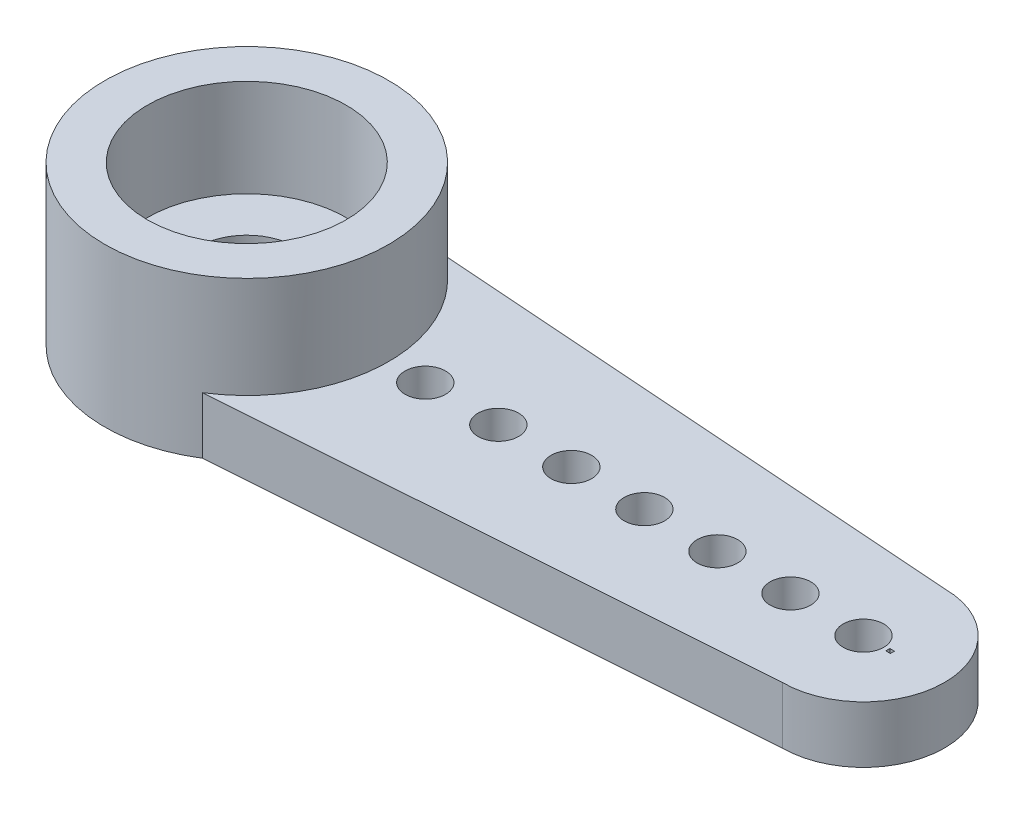
ISO-10303-21;
HEADER;
FILE_DESCRIPTION(('STEP AP214'),'2;1');
FILE_NAME('part.step','',(''),(''),'','','');
FILE_SCHEMA(('AUTOMOTIVE_DESIGN { 1 0 10303 214 1 1 1 1 }'));
ENDSEC;
DATA;
#1=APPLICATION_CONTEXT('core data for automotive mechanical design processes');
#2=APPLICATION_PROTOCOL_DEFINITION('international standard','automotive_design',2000,#1);
#3=PRODUCT_CONTEXT('',#1,'mechanical');
#4=PRODUCT('Part','Part','',(#3));
#5=PRODUCT_RELATED_PRODUCT_CATEGORY('part','',(#4));
#6=PRODUCT_DEFINITION_FORMATION('','',#4);
#7=PRODUCT_DEFINITION_CONTEXT('part definition',#1,'design');
#8=PRODUCT_DEFINITION('design','',#6,#7);
#9=PRODUCT_DEFINITION_SHAPE('','',#8);
#10=(LENGTH_UNIT() NAMED_UNIT(*) SI_UNIT(.MILLI.,.METRE.));
#11=(NAMED_UNIT(*) PLANE_ANGLE_UNIT() SI_UNIT($,.RADIAN.));
#12=(NAMED_UNIT(*) SI_UNIT($,.STERADIAN.) SOLID_ANGLE_UNIT());
#13=UNCERTAINTY_MEASURE_WITH_UNIT(LENGTH_MEASURE(1.E-05),#10,'distance_accuracy_value','');
#14=(GEOMETRIC_REPRESENTATION_CONTEXT(3) GLOBAL_UNCERTAINTY_ASSIGNED_CONTEXT((#13)) GLOBAL_UNIT_ASSIGNED_CONTEXT((#10,
#11,#12)) REPRESENTATION_CONTEXT('',''));
#15=CARTESIAN_POINT('',(0.,0.,0.));
#16=DIRECTION('',(0.,0.,1.));
#17=DIRECTION('',(1.,0.,0.));
#18=AXIS2_PLACEMENT_3D('',#15,#16,#17);
#19=CARTESIAN_POINT('',(-15.2,1.4,0.));
#20=DIRECTION('',(0.,1.,0.));
#21=DIRECTION('',(0.,0.,1.));
#22=AXIS2_PLACEMENT_3D('',#19,#20,#21);
#23=PLANE('',#22);
#24=DIRECTION('',(0.999999999999999,0.,0.));
#25=VECTOR('',#24,1.);
#26=CARTESIAN_POINT('',(1.38777878078145E-13,1.40000000000001,0.0499999999999945));
#27=LINE('',#26,#25);
#28=CARTESIAN_POINT('',(15.8000000000002,1.40000000000001,0.0499999999999945));
#29=VERTEX_POINT('',#28);
#30=CARTESIAN_POINT('',(15.9141028522073,1.4,0.0499999999999945));
#31=VERTEX_POINT('',#30);
#32=EDGE_CURVE('E50',#29,#31,#27,.T.);
#33=ORIENTED_EDGE('',*,*,#32,.F.);
#34=DIRECTION('',(0.,0.,-0.999999999999999));
#35=VECTOR('',#34,1.);
#36=CARTESIAN_POINT('',(15.8000000000001,1.40000000000001,0.));
#37=LINE('',#36,#35);
#38=CARTESIAN_POINT('',(15.8,1.40000000000001,-0.0500000000000222));
#39=VERTEX_POINT('',#38);
#40=EDGE_CURVE('E119',#29,#39,#37,.T.);
#41=ORIENTED_EDGE('',*,*,#40,.T.);
#42=DIRECTION('',(0.999999999999999,0.,0.));
#43=VECTOR('',#42,1.);
#44=CARTESIAN_POINT('',(1.66533453693773E-13,1.40000000000001,-0.0499999999999945));
#45=LINE('',#44,#43);
#46=CARTESIAN_POINT('',(15.9141028522072,1.40000000000001,-0.0499999999999945));
#47=VERTEX_POINT('',#46);
#48=EDGE_CURVE('E122',#39,#47,#45,.T.);
#49=ORIENTED_EDGE('',*,*,#48,.T.);
#50=DIRECTION('',(0.,0.,-0.999999999999999));
#51=VECTOR('',#50,1.);
#52=CARTESIAN_POINT('',(15.9141028522073,1.40000000000001,0.));
#53=LINE('',#52,#51);
#54=EDGE_CURVE('E128',#31,#47,#53,.T.);
#55=ORIENTED_EDGE('',*,*,#54,.F.);
#56=EDGE_LOOP('',(#33,#41,#49,#55));
#57=FACE_BOUND('',#56,.T.);
#58=CARTESIAN_POINT('',(6.2,1.4,0.));
#59=DIRECTION('',(0.,1.,0.));
#60=DIRECTION('',(0.,0.,1.));
#61=AXIS2_PLACEMENT_3D('',#58,#59,#60);
#62=CIRCLE('',#61,0.499999999999997);
#63=CARTESIAN_POINT('',(6.2,1.4,0.500000000000053));
#64=VERTEX_POINT('',#63);
#65=EDGE_CURVE('E180',#64,#64,#62,.T.);
#66=ORIENTED_EDGE('',*,*,#65,.F.);
#67=EDGE_LOOP('',(#66));
#68=FACE_BOUND('',#67,.T.);
#69=CARTESIAN_POINT('',(9.8,1.4,0.));
#70=DIRECTION('',(0.,1.,0.));
#71=DIRECTION('',(0.,0.,1.));
#72=AXIS2_PLACEMENT_3D('',#69,#70,#71);
#73=CIRCLE('',#72,0.499999999999997);
#74=CARTESIAN_POINT('',(9.8,1.4,0.500000000000028));
#75=VERTEX_POINT('',#74);
#76=EDGE_CURVE('E192',#75,#75,#73,.T.);
#77=ORIENTED_EDGE('',*,*,#76,.F.);
#78=EDGE_LOOP('',(#77));
#79=FACE_BOUND('',#78,.T.);
#80=CARTESIAN_POINT('',(13.4,1.4,0.));
#81=DIRECTION('',(0.,1.,0.));
#82=DIRECTION('',(0.,0.,1.));
#83=AXIS2_PLACEMENT_3D('',#80,#81,#82);
#84=CIRCLE('',#83,0.499999999999997);
#85=CARTESIAN_POINT('',(13.4,1.4,0.500000000000003));
#86=VERTEX_POINT('',#85);
#87=EDGE_CURVE('E204',#86,#86,#84,.T.);
#88=ORIENTED_EDGE('',*,*,#87,.F.);
#89=EDGE_LOOP('',(#88));
#90=FACE_BOUND('',#89,.T.);
#91=CARTESIAN_POINT('',(15.2,1.4,0.));
#92=DIRECTION('',(0.,1.,0.));
#93=DIRECTION('',(0.,0.,1.));
#94=AXIS2_PLACEMENT_3D('',#91,#92,#93);
#95=CIRCLE('',#94,0.499999999999997);
#96=CARTESIAN_POINT('',(15.2,1.4,0.49999999999999));
#97=VERTEX_POINT('',#96);
#98=EDGE_CURVE('E210',#97,#97,#95,.T.);
#99=ORIENTED_EDGE('',*,*,#98,.F.);
#100=EDGE_LOOP('',(#99));
#101=FACE_BOUND('',#100,.T.);
#102=CARTESIAN_POINT('',(11.6,1.4,0.));
#103=DIRECTION('',(0.,1.,0.));
#104=DIRECTION('',(0.,0.,1.));
#105=AXIS2_PLACEMENT_3D('',#102,#103,#104);
#106=CIRCLE('',#105,0.499999999999999);
#107=CARTESIAN_POINT('',(11.6,1.4,0.500000000000017));
#108=VERTEX_POINT('',#107);
#109=EDGE_CURVE('E198',#108,#108,#106,.T.);
#110=ORIENTED_EDGE('',*,*,#109,.F.);
#111=EDGE_LOOP('',(#110));
#112=FACE_BOUND('',#111,.T.);
#113=CARTESIAN_POINT('',(8.,1.4,0.));
#114=DIRECTION('',(0.,1.,0.));
#115=DIRECTION('',(0.,0.,1.));
#116=AXIS2_PLACEMENT_3D('',#113,#114,#115);
#117=CIRCLE('',#116,0.499999999999997);
#118=CARTESIAN_POINT('',(8.,1.4,0.500000000000041));
#119=VERTEX_POINT('',#118);
#120=EDGE_CURVE('E186',#119,#119,#117,.T.);
#121=ORIENTED_EDGE('',*,*,#120,.F.);
#122=EDGE_LOOP('',(#121));
#123=FACE_BOUND('',#122,.T.);
#124=CARTESIAN_POINT('',(4.4,1.4,0.));
#125=DIRECTION('',(0.,1.,0.));
#126=DIRECTION('',(0.,0.,1.));
#127=AXIS2_PLACEMENT_3D('',#124,#125,#126);
#128=CIRCLE('',#127,0.499999999999997);
#129=CARTESIAN_POINT('',(4.4,1.4,0.500000000000066));
#130=VERTEX_POINT('',#129);
#131=EDGE_CURVE('E174',#130,#130,#128,.T.);
#132=ORIENTED_EDGE('',*,*,#131,.F.);
#133=EDGE_LOOP('',(#132));
#134=FACE_BOUND('',#133,.T.);
#135=CARTESIAN_POINT('',(0.,1.4,0.));
#136=DIRECTION('',(0.,1.,0.));
#137=DIRECTION('',(0.,0.,1.));
#138=AXIS2_PLACEMENT_3D('',#135,#136,#137);
#139=CIRCLE('',#138,3.5);
#140=CARTESIAN_POINT('',(1.86858471289894,1.4,2.95945791838985));
#141=VERTEX_POINT('',#140);
#142=CARTESIAN_POINT('',(1.86858471289894,1.4,-2.95945791838985));
#143=VERTEX_POINT('',#142);
#144=EDGE_CURVE('E161',#141,#143,#139,.T.);
#145=ORIENTED_EDGE('',*,*,#144,.F.);
#146=DIRECTION('',(0.997420198870011,0.,-0.0717840294641297));
#147=VECTOR('',#146,1.);
#148=CARTESIAN_POINT('',(-14.9001527327747,1.4,4.16629887091939));
#149=LINE('',#148,#147);
#150=CARTESIAN_POINT('',(15.2,1.4,2.));
#151=VERTEX_POINT('',#150);
#152=EDGE_CURVE('E151',#141,#151,#149,.T.);
#153=ORIENTED_EDGE('',*,*,#152,.T.);
#154=CARTESIAN_POINT('',(15.2,1.4,0.));
#155=DIRECTION('',(0.,1.,0.));
#156=DIRECTION('',(0.,0.,-1.));
#157=AXIS2_PLACEMENT_3D('',#154,#155,#156);
#158=CIRCLE('',#157,2.);
#159=CARTESIAN_POINT('',(15.2,1.4,-2.));
#160=VERTEX_POINT('',#159);
#161=EDGE_CURVE('E216',#151,#160,#158,.T.);
#162=ORIENTED_EDGE('',*,*,#161,.T.);
#163=DIRECTION('',(-0.997420198870011,0.,-0.0717840294641295));
#164=VECTOR('',#163,1.);
#165=CARTESIAN_POINT('',(-14.9001527327747,1.4,-4.16629887091939));
#166=LINE('',#165,#164);
#167=EDGE_CURVE('E146',#160,#143,#166,.T.);
#168=ORIENTED_EDGE('',*,*,#167,.T.);
#169=EDGE_LOOP('',(#145,#153,#162,#168));
#170=FACE_BOUND('',#169,.T.);
#171=ADVANCED_FACE('F35',(#57,#68,#79,#90,#101,#112,#123,#134,#170),#23,.T.);
#172=CARTESIAN_POINT('',(-15.2,0.,0.));
#173=DIRECTION('',(0.,1.,0.));
#174=DIRECTION('',(0.,0.,1.));
#175=AXIS2_PLACEMENT_3D('',#172,#173,#174);
#176=PLANE('',#175);
#177=CARTESIAN_POINT('',(0.,0.,0.));
#178=DIRECTION('',(0.,-1.,0.));
#179=DIRECTION('',(0.,0.,-1.));
#180=AXIS2_PLACEMENT_3D('',#177,#178,#179);
#181=CIRCLE('',#180,2.35);
#182=CARTESIAN_POINT('',(0.,0.,-2.35));
#183=VERTEX_POINT('',#182);
#184=EDGE_CURVE('E165',#183,#183,#181,.T.);
#185=ORIENTED_EDGE('',*,*,#184,.F.);
#186=EDGE_LOOP('',(#185));
#187=FACE_BOUND('',#186,.T.);
#188=CARTESIAN_POINT('',(15.2,0.,0.));
#189=DIRECTION('',(0.,1.,0.));
#190=DIRECTION('',(0.,0.,1.));
#191=AXIS2_PLACEMENT_3D('',#188,#189,#190);
#192=CIRCLE('',#191,0.499999999999997);
#193=CARTESIAN_POINT('',(15.2,0.,0.49999999999999));
#194=VERTEX_POINT('',#193);
#195=EDGE_CURVE('E207',#194,#194,#192,.T.);
#196=ORIENTED_EDGE('',*,*,#195,.T.);
#197=EDGE_LOOP('',(#196));
#198=FACE_BOUND('',#197,.T.);
#199=CARTESIAN_POINT('',(13.4,0.,0.));
#200=DIRECTION('',(0.,1.,0.));
#201=DIRECTION('',(0.,0.,1.));
#202=AXIS2_PLACEMENT_3D('',#199,#200,#201);
#203=CIRCLE('',#202,0.499999999999997);
#204=CARTESIAN_POINT('',(13.4,0.,0.500000000000003));
#205=VERTEX_POINT('',#204);
#206=EDGE_CURVE('E201',#205,#205,#203,.T.);
#207=ORIENTED_EDGE('',*,*,#206,.T.);
#208=EDGE_LOOP('',(#207));
#209=FACE_BOUND('',#208,.T.);
#210=CARTESIAN_POINT('',(11.6,0.,0.));
#211=DIRECTION('',(0.,1.,0.));
#212=DIRECTION('',(0.,0.,1.));
#213=AXIS2_PLACEMENT_3D('',#210,#211,#212);
#214=CIRCLE('',#213,0.499999999999999);
#215=CARTESIAN_POINT('',(11.6,0.,0.500000000000017));
#216=VERTEX_POINT('',#215);
#217=EDGE_CURVE('E195',#216,#216,#214,.T.);
#218=ORIENTED_EDGE('',*,*,#217,.T.);
#219=EDGE_LOOP('',(#218));
#220=FACE_BOUND('',#219,.T.);
#221=CARTESIAN_POINT('',(9.8,0.,0.));
#222=DIRECTION('',(0.,1.,0.));
#223=DIRECTION('',(0.,0.,1.));
#224=AXIS2_PLACEMENT_3D('',#221,#222,#223);
#225=CIRCLE('',#224,0.499999999999997);
#226=CARTESIAN_POINT('',(9.8,0.,0.500000000000028));
#227=VERTEX_POINT('',#226);
#228=EDGE_CURVE('E189',#227,#227,#225,.T.);
#229=ORIENTED_EDGE('',*,*,#228,.T.);
#230=EDGE_LOOP('',(#229));
#231=FACE_BOUND('',#230,.T.);
#232=CARTESIAN_POINT('',(8.,0.,0.));
#233=DIRECTION('',(0.,1.,0.));
#234=DIRECTION('',(0.,0.,1.));
#235=AXIS2_PLACEMENT_3D('',#232,#233,#234);
#236=CIRCLE('',#235,0.499999999999997);
#237=CARTESIAN_POINT('',(8.,0.,0.500000000000041));
#238=VERTEX_POINT('',#237);
#239=EDGE_CURVE('E183',#238,#238,#236,.T.);
#240=ORIENTED_EDGE('',*,*,#239,.T.);
#241=EDGE_LOOP('',(#240));
#242=FACE_BOUND('',#241,.T.);
#243=CARTESIAN_POINT('',(6.2,0.,0.));
#244=DIRECTION('',(0.,1.,0.));
#245=DIRECTION('',(0.,0.,1.));
#246=AXIS2_PLACEMENT_3D('',#243,#244,#245);
#247=CIRCLE('',#246,0.499999999999997);
#248=CARTESIAN_POINT('',(6.2,0.,0.500000000000053));
#249=VERTEX_POINT('',#248);
#250=EDGE_CURVE('E177',#249,#249,#247,.T.);
#251=ORIENTED_EDGE('',*,*,#250,.T.);
#252=EDGE_LOOP('',(#251));
#253=FACE_BOUND('',#252,.T.);
#254=CARTESIAN_POINT('',(4.4,0.,0.));
#255=DIRECTION('',(0.,1.,0.));
#256=DIRECTION('',(0.,0.,1.));
#257=AXIS2_PLACEMENT_3D('',#254,#255,#256);
#258=CIRCLE('',#257,0.499999999999997);
#259=CARTESIAN_POINT('',(4.4,0.,0.500000000000066));
#260=VERTEX_POINT('',#259);
#261=EDGE_CURVE('E171',#260,#260,#258,.T.);
#262=ORIENTED_EDGE('',*,*,#261,.T.);
#263=EDGE_LOOP('',(#262));
#264=FACE_BOUND('',#263,.T.);
#265=CARTESIAN_POINT('',(0.,0.,0.));
#266=DIRECTION('',(0.,-1.,0.));
#267=DIRECTION('',(0.,0.,-1.));
#268=AXIS2_PLACEMENT_3D('',#265,#266,#267);
#269=CIRCLE('',#268,3.5);
#270=CARTESIAN_POINT('',(1.86858471289894,0.,2.95945791838985));
#271=VERTEX_POINT('',#270);
#272=CARTESIAN_POINT('',(1.86858471289894,0.,-2.95945791838985));
#273=VERTEX_POINT('',#272);
#274=EDGE_CURVE('E141',#271,#273,#269,.T.);
#275=ORIENTED_EDGE('',*,*,#274,.T.);
#276=DIRECTION('',(0.997420198870011,0.,0.0717840294641295));
#277=VECTOR('',#276,1.);
#278=CARTESIAN_POINT('',(1.86858471289894,0.,-2.95945791838985));
#279=LINE('',#278,#277);
#280=CARTESIAN_POINT('',(15.2,0.,-2.));
#281=VERTEX_POINT('',#280);
#282=EDGE_CURVE('E134',#273,#281,#279,.T.);
#283=ORIENTED_EDGE('',*,*,#282,.T.);
#284=CARTESIAN_POINT('',(15.2,0.,0.));
#285=DIRECTION('',(0.,1.,0.));
#286=DIRECTION('',(0.,0.,-1.));
#287=AXIS2_PLACEMENT_3D('',#284,#285,#286);
#288=CIRCLE('',#287,2.);
#289=CARTESIAN_POINT('',(15.2,0.,1.99999999999999));
#290=VERTEX_POINT('',#289);
#291=EDGE_CURVE('E213',#290,#281,#288,.T.);
#292=ORIENTED_EDGE('',*,*,#291,.F.);
#293=DIRECTION('',(-0.997420198870011,0.,0.0717840294641296));
#294=VECTOR('',#293,1.);
#295=CARTESIAN_POINT('',(15.2,0.,2.));
#296=LINE('',#295,#294);
#297=EDGE_CURVE('E58',#290,#271,#296,.T.);
#298=ORIENTED_EDGE('',*,*,#297,.T.);
#299=EDGE_LOOP('',(#275,#283,#292,#298));
#300=FACE_BOUND('',#299,.T.);
#301=ADVANCED_FACE('F243',(#187,#198,#209,#220,#231,#242,#253,#264,#300),#176,.F.);
#302=CARTESIAN_POINT('',(15.2,1.4,0.));
#303=DIRECTION('',(0.,-1.,0.));
#304=DIRECTION('',(0.,0.,-1.));
#305=AXIS2_PLACEMENT_3D('',#302,#303,#304);
#306=CYLINDRICAL_SURFACE('',#305,2.);
#307=ORIENTED_EDGE('',*,*,#291,.T.);
#308=DIRECTION('',(0.,-1.,0.));
#309=VECTOR('',#308,1.);
#310=CARTESIAN_POINT('',(15.2,1.4,-2.00000000000001));
#311=LINE('',#310,#309);
#312=EDGE_CURVE('E219',#160,#281,#311,.T.);
#313=ORIENTED_EDGE('',*,*,#312,.F.);
#314=ORIENTED_EDGE('',*,*,#161,.F.);
#315=DIRECTION('',(0.,-1.,0.));
#316=VECTOR('',#315,1.);
#317=CARTESIAN_POINT('',(15.2,1.4,1.99999999999999));
#318=LINE('',#317,#316);
#319=EDGE_CURVE('E43',#151,#290,#318,.T.);
#320=ORIENTED_EDGE('',*,*,#319,.T.);
#321=EDGE_LOOP('',(#307,#313,#314,#320));
#322=FACE_BOUND('',#321,.T.);
#323=ADVANCED_FACE('F37',(#322),#306,.T.);
#324=CARTESIAN_POINT('',(15.2,1.4,0.));
#325=DIRECTION('',(0.,-1.,0.));
#326=DIRECTION('',(0.,0.,-1.));
#327=AXIS2_PLACEMENT_3D('',#324,#325,#326);
#328=CYLINDRICAL_SURFACE('',#327,0.499999999999997);
#329=ORIENTED_EDGE('',*,*,#98,.T.);
#330=EDGE_LOOP('',(#329));
#331=FACE_BOUND('',#330,.T.);
#332=ORIENTED_EDGE('',*,*,#195,.F.);
#333=EDGE_LOOP('',(#332));
#334=FACE_BOUND('',#333,.T.);
#335=ADVANCED_FACE('F282',(#331,#334),#328,.F.);
#336=CARTESIAN_POINT('',(13.4,1.4,0.));
#337=DIRECTION('',(0.,-1.,0.));
#338=DIRECTION('',(0.,0.,-1.));
#339=AXIS2_PLACEMENT_3D('',#336,#337,#338);
#340=CYLINDRICAL_SURFACE('',#339,0.499999999999997);
#341=ORIENTED_EDGE('',*,*,#87,.T.);
#342=EDGE_LOOP('',(#341));
#343=FACE_BOUND('',#342,.T.);
#344=ORIENTED_EDGE('',*,*,#206,.F.);
#345=EDGE_LOOP('',(#344));
#346=FACE_BOUND('',#345,.T.);
#347=ADVANCED_FACE('F285',(#343,#346),#340,.F.);
#348=CARTESIAN_POINT('',(11.6,1.4,0.));
#349=DIRECTION('',(0.,-1.,0.));
#350=DIRECTION('',(0.,0.,-1.));
#351=AXIS2_PLACEMENT_3D('',#348,#349,#350);
#352=CYLINDRICAL_SURFACE('',#351,0.499999999999999);
#353=ORIENTED_EDGE('',*,*,#109,.T.);
#354=EDGE_LOOP('',(#353));
#355=FACE_BOUND('',#354,.T.);
#356=ORIENTED_EDGE('',*,*,#217,.F.);
#357=EDGE_LOOP('',(#356));
#358=FACE_BOUND('',#357,.T.);
#359=ADVANCED_FACE('F289',(#355,#358),#352,.F.);
#360=CARTESIAN_POINT('',(9.8,1.4,0.));
#361=DIRECTION('',(0.,-1.,0.));
#362=DIRECTION('',(0.,0.,-1.));
#363=AXIS2_PLACEMENT_3D('',#360,#361,#362);
#364=CYLINDRICAL_SURFACE('',#363,0.499999999999997);
#365=ORIENTED_EDGE('',*,*,#76,.T.);
#366=EDGE_LOOP('',(#365));
#367=FACE_BOUND('',#366,.T.);
#368=ORIENTED_EDGE('',*,*,#228,.F.);
#369=EDGE_LOOP('',(#368));
#370=FACE_BOUND('',#369,.T.);
#371=ADVANCED_FACE('F293',(#367,#370),#364,.F.);
#372=CARTESIAN_POINT('',(8.,1.4,0.));
#373=DIRECTION('',(0.,-1.,0.));
#374=DIRECTION('',(0.,0.,-1.));
#375=AXIS2_PLACEMENT_3D('',#372,#373,#374);
#376=CYLINDRICAL_SURFACE('',#375,0.499999999999997);
#377=ORIENTED_EDGE('',*,*,#120,.T.);
#378=EDGE_LOOP('',(#377));
#379=FACE_BOUND('',#378,.T.);
#380=ORIENTED_EDGE('',*,*,#239,.F.);
#381=EDGE_LOOP('',(#380));
#382=FACE_BOUND('',#381,.T.);
#383=ADVANCED_FACE('F297',(#379,#382),#376,.F.);
#384=CARTESIAN_POINT('',(6.2,1.4,0.));
#385=DIRECTION('',(0.,-1.,0.));
#386=DIRECTION('',(0.,0.,-1.));
#387=AXIS2_PLACEMENT_3D('',#384,#385,#386);
#388=CYLINDRICAL_SURFACE('',#387,0.499999999999997);
#389=ORIENTED_EDGE('',*,*,#65,.T.);
#390=EDGE_LOOP('',(#389));
#391=FACE_BOUND('',#390,.T.);
#392=ORIENTED_EDGE('',*,*,#250,.F.);
#393=EDGE_LOOP('',(#392));
#394=FACE_BOUND('',#393,.T.);
#395=ADVANCED_FACE('F301',(#391,#394),#388,.F.);
#396=CARTESIAN_POINT('',(4.4,1.4,0.));
#397=DIRECTION('',(0.,-1.,0.));
#398=DIRECTION('',(0.,0.,-1.));
#399=AXIS2_PLACEMENT_3D('',#396,#397,#398);
#400=CYLINDRICAL_SURFACE('',#399,0.499999999999997);
#401=ORIENTED_EDGE('',*,*,#131,.T.);
#402=EDGE_LOOP('',(#401));
#403=FACE_BOUND('',#402,.T.);
#404=ORIENTED_EDGE('',*,*,#261,.F.);
#405=EDGE_LOOP('',(#404));
#406=FACE_BOUND('',#405,.T.);
#407=ADVANCED_FACE('F239',(#403,#406),#400,.F.);
#408=CARTESIAN_POINT('',(0.,1.,0.));
#409=DIRECTION('',(0.,-1.,0.));
#410=DIRECTION('',(0.,0.,-1.));
#411=AXIS2_PLACEMENT_3D('',#408,#409,#410);
#412=CYLINDRICAL_SURFACE('',#411,2.35);
#413=CARTESIAN_POINT('',(0.,1.,0.));
#414=DIRECTION('',(0.,-1.,0.));
#415=DIRECTION('',(0.,0.,-1.));
#416=AXIS2_PLACEMENT_3D('',#413,#414,#415);
#417=CIRCLE('',#416,2.35);
#418=CARTESIAN_POINT('',(0.,1.,-2.35));
#419=VERTEX_POINT('',#418);
#420=EDGE_CURVE('E168',#419,#419,#417,.T.);
#421=ORIENTED_EDGE('',*,*,#420,.F.);
#422=EDGE_LOOP('',(#421));
#423=FACE_BOUND('',#422,.T.);
#424=ORIENTED_EDGE('',*,*,#184,.T.);
#425=EDGE_LOOP('',(#424));
#426=FACE_BOUND('',#425,.T.);
#427=ADVANCED_FACE('F233',(#423,#426),#412,.F.);
#428=CARTESIAN_POINT('',(0.,1.,0.));
#429=DIRECTION('',(0.,-1.,0.));
#430=DIRECTION('',(0.,0.,-1.));
#431=AXIS2_PLACEMENT_3D('',#428,#429,#430);
#432=PLANE('',#431);
#433=CARTESIAN_POINT('',(0.,1.,0.));
#434=DIRECTION('',(0.,-1.,0.));
#435=DIRECTION('',(0.,0.,-1.));
#436=AXIS2_PLACEMENT_3D('',#433,#434,#435);
#437=CIRCLE('',#436,1.2);
#438=CARTESIAN_POINT('',(0.,1.,-1.2));
#439=VERTEX_POINT('',#438);
#440=EDGE_CURVE('E157',#439,#439,#437,.T.);
#441=ORIENTED_EDGE('',*,*,#440,.F.);
#442=EDGE_LOOP('',(#441));
#443=FACE_BOUND('',#442,.T.);
#444=ORIENTED_EDGE('',*,*,#420,.T.);
#445=EDGE_LOOP('',(#444));
#446=FACE_BOUND('',#445,.T.);
#447=ADVANCED_FACE('F229',(#443,#446),#432,.T.);
#448=CARTESIAN_POINT('',(0.,3.9,0.));
#449=DIRECTION('',(0.,1.,0.));
#450=DIRECTION('',(0.,0.,1.));
#451=AXIS2_PLACEMENT_3D('',#448,#449,#450);
#452=PLANE('',#451);
#453=CARTESIAN_POINT('',(0.,3.9,0.));
#454=DIRECTION('',(0.,1.,0.));
#455=DIRECTION('',(0.,0.,1.));
#456=AXIS2_PLACEMENT_3D('',#453,#454,#455);
#457=CIRCLE('',#456,3.5);
#458=CARTESIAN_POINT('',(0.,3.9,3.5));
#459=VERTEX_POINT('',#458);
#460=EDGE_CURVE('E162',#459,#459,#457,.T.);
#461=ORIENTED_EDGE('',*,*,#460,.T.);
#462=EDGE_LOOP('',(#461));
#463=FACE_BOUND('',#462,.T.);
#464=CARTESIAN_POINT('',(0.,3.9,0.));
#465=DIRECTION('',(0.,1.,0.));
#466=DIRECTION('',(0.,0.,1.));
#467=AXIS2_PLACEMENT_3D('',#464,#465,#466);
#468=CIRCLE('',#467,2.45);
#469=CARTESIAN_POINT('',(0.,3.9,2.45));
#470=VERTEX_POINT('',#469);
#471=EDGE_CURVE('E158',#470,#470,#468,.T.);
#472=ORIENTED_EDGE('',*,*,#471,.F.);
#473=EDGE_LOOP('',(#472));
#474=FACE_BOUND('',#473,.T.);
#475=ADVANCED_FACE('F232',(#463,#474),#452,.T.);
#476=CARTESIAN_POINT('',(0.,3.9,0.));
#477=DIRECTION('',(0.,-1.,0.));
#478=DIRECTION('',(0.,0.,-1.));
#479=AXIS2_PLACEMENT_3D('',#476,#477,#478);
#480=CYLINDRICAL_SURFACE('',#479,3.5);
#481=DIRECTION('',(0.,-1.,0.));
#482=VECTOR('',#481,1.);
#483=CARTESIAN_POINT('',(1.86858471289894,3.9,-2.95945791838985));
#484=LINE('',#483,#482);
#485=EDGE_CURVE('E143',#143,#273,#484,.T.);
#486=ORIENTED_EDGE('',*,*,#485,.T.);
#487=ORIENTED_EDGE('',*,*,#274,.F.);
#488=DIRECTION('',(0.,-1.,0.));
#489=VECTOR('',#488,1.);
#490=CARTESIAN_POINT('',(1.86858471289894,3.9,2.95945791838985));
#491=LINE('',#490,#489);
#492=EDGE_CURVE('E144',#141,#271,#491,.T.);
#493=ORIENTED_EDGE('',*,*,#492,.F.);
#494=ORIENTED_EDGE('',*,*,#144,.T.);
#495=EDGE_LOOP('',(#486,#487,#493,#494));
#496=FACE_BOUND('',#495,.T.);
#497=ORIENTED_EDGE('',*,*,#460,.F.);
#498=EDGE_LOOP('',(#497));
#499=FACE_BOUND('',#498,.T.);
#500=ADVANCED_FACE('F265',(#496,#499),#480,.T.);
#501=CARTESIAN_POINT('',(0.,3.9,0.));
#502=DIRECTION('',(0.,-1.,0.));
#503=DIRECTION('',(0.,0.,-1.));
#504=AXIS2_PLACEMENT_3D('',#501,#502,#503);
#505=CYLINDRICAL_SURFACE('',#504,2.45);
#506=CARTESIAN_POINT('',(0.,1.5,0.));
#507=DIRECTION('',(0.,1.,0.));
#508=DIRECTION('',(0.,0.,1.));
#509=AXIS2_PLACEMENT_3D('',#506,#507,#508);
#510=CIRCLE('',#509,2.45);
#511=CARTESIAN_POINT('',(0.,1.5,2.45));
#512=VERTEX_POINT('',#511);
#513=EDGE_CURVE('E11',#512,#512,#510,.T.);
#514=ORIENTED_EDGE('',*,*,#513,.F.);
#515=EDGE_LOOP('',(#514));
#516=FACE_BOUND('',#515,.T.);
#517=ORIENTED_EDGE('',*,*,#471,.T.);
#518=EDGE_LOOP('',(#517));
#519=FACE_BOUND('',#518,.T.);
#520=ADVANCED_FACE('F311',(#516,#519),#505,.F.);
#521=CARTESIAN_POINT('',(0.,0.,0.));
#522=DIRECTION('',(0.,1.,0.));
#523=DIRECTION('',(0.,0.,1.));
#524=AXIS2_PLACEMENT_3D('',#521,#522,#523);
#525=CYLINDRICAL_SURFACE('',#524,1.2);
#526=ORIENTED_EDGE('',*,*,#440,.T.);
#527=EDGE_LOOP('',(#526));
#528=FACE_BOUND('',#527,.T.);
#529=CARTESIAN_POINT('',(0.,1.5,0.));
#530=DIRECTION('',(0.,1.,0.));
#531=DIRECTION('',(0.,0.,1.));
#532=AXIS2_PLACEMENT_3D('',#529,#530,#531);
#533=CIRCLE('',#532,1.2);
#534=CARTESIAN_POINT('',(0.,1.5,1.2));
#535=VERTEX_POINT('',#534);
#536=EDGE_CURVE('E154',#535,#535,#533,.T.);
#537=ORIENTED_EDGE('',*,*,#536,.T.);
#538=EDGE_LOOP('',(#537));
#539=FACE_BOUND('',#538,.T.);
#540=ADVANCED_FACE('F226',(#528,#539),#525,.F.);
#541=CARTESIAN_POINT('',(0.,1.5,0.));
#542=DIRECTION('',(0.,1.,0.));
#543=DIRECTION('',(0.,0.,1.));
#544=AXIS2_PLACEMENT_3D('',#541,#542,#543);
#545=PLANE('',#544);
#546=ORIENTED_EDGE('',*,*,#513,.T.);
#547=EDGE_LOOP('',(#546));
#548=FACE_BOUND('',#547,.T.);
#549=ORIENTED_EDGE('',*,*,#536,.F.);
#550=EDGE_LOOP('',(#549));
#551=FACE_BOUND('',#550,.T.);
#552=ADVANCED_FACE('F320',(#548,#551),#545,.T.);
#553=CARTESIAN_POINT('',(1.86858471289894,3.9,-2.95945791838985));
#554=DIRECTION('',(0.0717840294641295,0.,-0.997420198870011));
#555=DIRECTION('',(-0.997420198870011,0.,-0.0717840294641295));
#556=AXIS2_PLACEMENT_3D('',#553,#554,#555);
#557=PLANE('',#556);
#558=ORIENTED_EDGE('',*,*,#312,.T.);
#559=ORIENTED_EDGE('',*,*,#282,.F.);
#560=ORIENTED_EDGE('',*,*,#485,.F.);
#561=ORIENTED_EDGE('',*,*,#167,.F.);
#562=EDGE_LOOP('',(#558,#559,#560,#561));
#563=FACE_BOUND('',#562,.T.);
#564=ADVANCED_FACE('F269',(#563),#557,.T.);
#565=CARTESIAN_POINT('',(15.2,3.9,2.));
#566=DIRECTION('',(0.0717840294641297,0.,0.997420198870011));
#567=DIRECTION('',(0.997420198870011,0.,-0.0717840294641297));
#568=AXIS2_PLACEMENT_3D('',#565,#566,#567);
#569=PLANE('',#568);
#570=ORIENTED_EDGE('',*,*,#492,.T.);
#571=ORIENTED_EDGE('',*,*,#297,.F.);
#572=ORIENTED_EDGE('',*,*,#319,.F.);
#573=ORIENTED_EDGE('',*,*,#152,.F.);
#574=EDGE_LOOP('',(#570,#571,#572,#573));
#575=FACE_BOUND('',#574,.T.);
#576=ADVANCED_FACE('F273',(#575),#569,.T.);
#577=CARTESIAN_POINT('',(1.38777878078145E-13,1.30000000000001,0.0499999999999945));
#578=DIRECTION('',(0.,0.,1.));
#579=DIRECTION('',(1.,0.,0.));
#580=AXIS2_PLACEMENT_3D('',#577,#578,#579);
#581=PLANE('',#580);
#582=ORIENTED_EDGE('',*,*,#32,.T.);
#583=DIRECTION('',(0.,1.,0.));
#584=VECTOR('',#583,1.);
#585=CARTESIAN_POINT('',(15.9141028522072,1.30000000000001,0.0499999999999945));
#586=LINE('',#585,#584);
#587=CARTESIAN_POINT('',(15.9141028522072,1.30000000000001,0.0499999999999945));
#588=VERTEX_POINT('',#587);
#589=EDGE_CURVE('E98',#588,#31,#586,.T.);
#590=ORIENTED_EDGE('',*,*,#589,.F.);
#591=DIRECTION('',(0.999999999999999,0.,0.));
#592=VECTOR('',#591,1.);
#593=CARTESIAN_POINT('',(1.38777878078145E-13,1.30000000000001,0.0499999999999945));
#594=LINE('',#593,#592);
#595=CARTESIAN_POINT('',(15.8000000000002,1.30000000000001,0.0499999999999945));
#596=VERTEX_POINT('',#595);
#597=EDGE_CURVE('E102',#596,#588,#594,.T.);
#598=ORIENTED_EDGE('',*,*,#597,.F.);
#599=DIRECTION('',(0.,1.,0.));
#600=VECTOR('',#599,1.);
#601=CARTESIAN_POINT('',(15.8000000000002,1.30000000000001,0.0499999999999945));
#602=LINE('',#601,#600);
#603=EDGE_CURVE('E132',#596,#29,#602,.T.);
#604=ORIENTED_EDGE('',*,*,#603,.T.);
#605=EDGE_LOOP('',(#582,#590,#598,#604));
#606=FACE_BOUND('',#605,.T.);
#607=ADVANCED_FACE('F100',(#606),#581,.F.);
#608=CARTESIAN_POINT('',(15.8000000000001,1.30000000000001,0.));
#609=DIRECTION('',(1.,0.,0.));
#610=DIRECTION('',(0.,0.,-1.));
#611=AXIS2_PLACEMENT_3D('',#608,#609,#610);
#612=PLANE('',#611);
#613=ORIENTED_EDGE('',*,*,#40,.F.);
#614=ORIENTED_EDGE('',*,*,#603,.F.);
#615=DIRECTION('',(0.,0.,-0.999999999999999));
#616=VECTOR('',#615,1.);
#617=CARTESIAN_POINT('',(15.8000000000001,1.30000000000001,0.));
#618=LINE('',#617,#616);
#619=CARTESIAN_POINT('',(15.8,1.30000000000001,-0.0500000000000222));
#620=VERTEX_POINT('',#619);
#621=EDGE_CURVE('E107',#596,#620,#618,.T.);
#622=ORIENTED_EDGE('',*,*,#621,.T.);
#623=DIRECTION('',(0.,1.,0.));
#624=VECTOR('',#623,1.);
#625=CARTESIAN_POINT('',(15.8,1.30000000000001,-0.0500000000000222));
#626=LINE('',#625,#624);
#627=EDGE_CURVE('E135',#620,#39,#626,.T.);
#628=ORIENTED_EDGE('',*,*,#627,.T.);
#629=EDGE_LOOP('',(#613,#614,#622,#628));
#630=FACE_BOUND('',#629,.T.);
#631=ADVANCED_FACE('F330',(#630),#612,.T.);
#632=CARTESIAN_POINT('',(1.66533453693773E-13,1.30000000000001,-0.0499999999999945));
#633=DIRECTION('',(0.,0.,1.));
#634=DIRECTION('',(1.,0.,0.));
#635=AXIS2_PLACEMENT_3D('',#632,#633,#634);
#636=PLANE('',#635);
#637=ORIENTED_EDGE('',*,*,#48,.F.);
#638=ORIENTED_EDGE('',*,*,#627,.F.);
#639=DIRECTION('',(0.999999999999999,0.,0.));
#640=VECTOR('',#639,1.);
#641=CARTESIAN_POINT('',(1.66533453693773E-13,1.30000000000001,-0.0499999999999945));
#642=LINE('',#641,#640);
#643=CARTESIAN_POINT('',(15.9141028522072,1.30000000000001,-0.0499999999999945));
#644=VERTEX_POINT('',#643);
#645=EDGE_CURVE('E115',#620,#644,#642,.T.);
#646=ORIENTED_EDGE('',*,*,#645,.T.);
#647=DIRECTION('',(0.,1.,0.));
#648=VECTOR('',#647,1.);
#649=CARTESIAN_POINT('',(15.9141028522072,1.30000000000001,-0.0499999999999945));
#650=LINE('',#649,#648);
#651=EDGE_CURVE('E106',#644,#47,#650,.T.);
#652=ORIENTED_EDGE('',*,*,#651,.T.);
#653=EDGE_LOOP('',(#637,#638,#646,#652));
#654=FACE_BOUND('',#653,.T.);
#655=ADVANCED_FACE('F333',(#654),#636,.T.);
#656=CARTESIAN_POINT('',(15.9141028522073,1.30000000000001,0.));
#657=DIRECTION('',(1.,0.,0.));
#658=DIRECTION('',(0.,0.,-1.));
#659=AXIS2_PLACEMENT_3D('',#656,#657,#658);
#660=PLANE('',#659);
#661=ORIENTED_EDGE('',*,*,#54,.T.);
#662=ORIENTED_EDGE('',*,*,#651,.F.);
#663=DIRECTION('',(0.,0.,-0.999999999999999));
#664=VECTOR('',#663,1.);
#665=CARTESIAN_POINT('',(15.9141028522073,1.30000000000001,0.));
#666=LINE('',#665,#664);
#667=EDGE_CURVE('E111',#588,#644,#666,.T.);
#668=ORIENTED_EDGE('',*,*,#667,.F.);
#669=ORIENTED_EDGE('',*,*,#589,.T.);
#670=EDGE_LOOP('',(#661,#662,#668,#669));
#671=FACE_BOUND('',#670,.T.);
#672=ADVANCED_FACE('F112',(#671),#660,.F.);
#673=CARTESIAN_POINT('',(0.,1.30000000000001,0.));
#674=DIRECTION('',(0.,1.,0.));
#675=DIRECTION('',(0.,0.,0.999999999999999));
#676=AXIS2_PLACEMENT_3D('',#673,#674,#675);
#677=PLANE('',#676);
#678=ORIENTED_EDGE('',*,*,#597,.T.);
#679=ORIENTED_EDGE('',*,*,#667,.T.);
#680=ORIENTED_EDGE('',*,*,#645,.F.);
#681=ORIENTED_EDGE('',*,*,#621,.F.);
#682=EDGE_LOOP('',(#678,#679,#680,#681));
#683=FACE_BOUND('',#682,.T.);
#684=ADVANCED_FACE('F118',(#683),#677,.T.);
#685=CLOSED_SHELL('',(#171,#301,#323,#335,#347,#359,#371,#383,#395,#407,#427,#447,#475,#500,
#520,#540,#552,#564,#576,#607,#631,#655,#672,#684));
#686=MANIFOLD_SOLID_BREP('B2',#685);
#687=ADVANCED_BREP_SHAPE_REPRESENTATION('',(#18,#686),#14);
#688=SHAPE_DEFINITION_REPRESENTATION(#9,#687);
ENDSEC;
END-ISO-10303-21;
